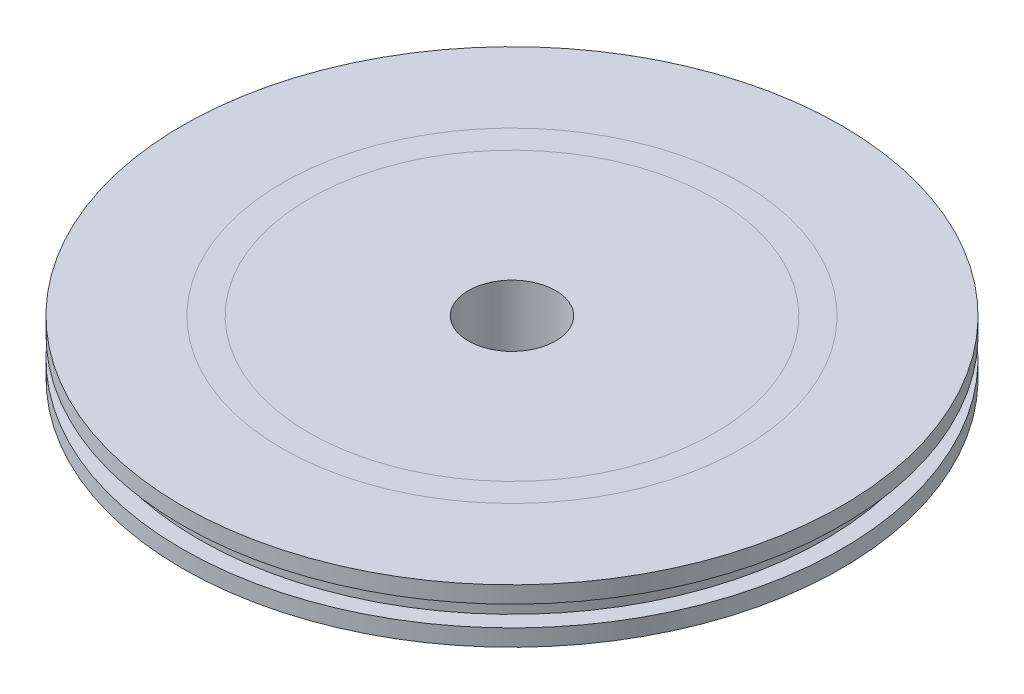
ISO-10303-21;
HEADER;
FILE_DESCRIPTION(('STEP AP214'),'2;1');
FILE_NAME('part.step','',(''),(''),'','','');
FILE_SCHEMA(('AUTOMOTIVE_DESIGN { 1 0 10303 214 1 1 1 1 }'));
ENDSEC;
DATA;
#1=APPLICATION_CONTEXT('core data for automotive mechanical design processes');
#2=APPLICATION_PROTOCOL_DEFINITION('international standard','automotive_design',2000,#1);
#3=PRODUCT_CONTEXT('',#1,'mechanical');
#4=PRODUCT('Part','Part','',(#3));
#5=PRODUCT_RELATED_PRODUCT_CATEGORY('part','',(#4));
#6=PRODUCT_DEFINITION_FORMATION('','',#4);
#7=PRODUCT_DEFINITION_CONTEXT('part definition',#1,'design');
#8=PRODUCT_DEFINITION('design','',#6,#7);
#9=PRODUCT_DEFINITION_SHAPE('','',#8);
#10=(LENGTH_UNIT() NAMED_UNIT(*) SI_UNIT(.MILLI.,.METRE.));
#11=(NAMED_UNIT(*) PLANE_ANGLE_UNIT() SI_UNIT($,.RADIAN.));
#12=(NAMED_UNIT(*) SI_UNIT($,.STERADIAN.) SOLID_ANGLE_UNIT());
#13=UNCERTAINTY_MEASURE_WITH_UNIT(LENGTH_MEASURE(1.E-05),#10,'distance_accuracy_value','');
#14=(GEOMETRIC_REPRESENTATION_CONTEXT(3) GLOBAL_UNCERTAINTY_ASSIGNED_CONTEXT((#13)) GLOBAL_UNIT_ASSIGNED_CONTEXT((#10,
#11,#12)) REPRESENTATION_CONTEXT('',''));
#15=CARTESIAN_POINT('',(0.,0.,0.));
#16=DIRECTION('',(0.,0.,1.));
#17=DIRECTION('',(1.,0.,0.));
#18=AXIS2_PLACEMENT_3D('',#15,#16,#17);
#19=CARTESIAN_POINT('',(0.,0.,30.9499));
#20=DIRECTION('',(0.,1.,0.));
#21=DIRECTION('',(0.,0.,1.));
#22=AXIS2_PLACEMENT_3D('',#19,#20,#21);
#23=PLANE('',#22);
#24=CARTESIAN_POINT('',(0.,0.,0.));
#25=DIRECTION('',(0.,1.,0.));
#26=DIRECTION('',(0.,0.,1.));
#27=AXIS2_PLACEMENT_3D('',#24,#25,#26);
#28=CIRCLE('',#27,30.9499);
#29=CARTESIAN_POINT('',(0.,0.,30.9499));
#30=VERTEX_POINT('',#29);
#31=EDGE_CURVE('E70',#30,#30,#28,.T.);
#32=ORIENTED_EDGE('',*,*,#31,.T.);
#33=EDGE_LOOP('',(#32));
#34=FACE_BOUND('',#33,.T.);
#35=CARTESIAN_POINT('',(0.,0.,0.));
#36=DIRECTION('',(0.,1.,0.));
#37=DIRECTION('',(0.,0.,1.));
#38=AXIS2_PLACEMENT_3D('',#35,#36,#37);
#39=CIRCLE('',#38,21.59);
#40=CARTESIAN_POINT('',(0.,0.,21.59));
#41=VERTEX_POINT('',#40);
#42=EDGE_CURVE('E51',#41,#41,#39,.F.);
#43=ORIENTED_EDGE('',*,*,#42,.T.);
#44=EDGE_LOOP('',(#43));
#45=FACE_BOUND('',#44,.T.);
#46=ADVANCED_FACE('F47',(#34,#45),#23,.T.);
#47=ORIENTED_EDGE('',*,*,#42,.F.);
#48=EDGE_LOOP('',(#47));
#49=FACE_BOUND('',#48,.T.);
#50=CARTESIAN_POINT('',(0.,0.,0.));
#51=DIRECTION('',(0.,1.,0.));
#52=DIRECTION('',(0.,0.,1.));
#53=AXIS2_PLACEMENT_3D('',#50,#51,#52);
#54=CIRCLE('',#53,19.05);
#55=CARTESIAN_POINT('',(0.,0.,19.05));
#56=VERTEX_POINT('',#55);
#57=EDGE_CURVE('E61',#56,#56,#54,.F.);
#58=ORIENTED_EDGE('',*,*,#57,.T.);
#59=EDGE_LOOP('',(#58));
#60=FACE_BOUND('',#59,.T.);
#61=ADVANCED_FACE('F98',(#49,#60),#23,.T.);
#62=CARTESIAN_POINT('',(0.,0.,0.));
#63=DIRECTION('',(0.,-1.,0.));
#64=DIRECTION('',(0.,0.,-1.));
#65=AXIS2_PLACEMENT_3D('',#62,#63,#64);
#66=CIRCLE('',#65,4.1021);
#67=CARTESIAN_POINT('',(0.,0.,-4.1021));
#68=VERTEX_POINT('',#67);
#69=EDGE_CURVE('E66',#68,#68,#66,.T.);
#70=ORIENTED_EDGE('',*,*,#69,.T.);
#71=EDGE_LOOP('',(#70));
#72=FACE_BOUND('',#71,.T.);
#73=ORIENTED_EDGE('',*,*,#57,.F.);
#74=EDGE_LOOP('',(#73));
#75=FACE_BOUND('',#74,.T.);
#76=ADVANCED_FACE('F49',(#72,#75),#23,.T.);
#77=CARTESIAN_POINT('',(0.,-5.08,0.));
#78=DIRECTION('',(0.,-1.,0.));
#79=DIRECTION('',(0.,0.,-1.));
#80=AXIS2_PLACEMENT_3D('',#77,#78,#79);
#81=PLANE('',#80);
#82=CARTESIAN_POINT('',(0.,-5.08,0.));
#83=DIRECTION('',(0.,-1.,0.));
#84=DIRECTION('',(0.,0.,-1.));
#85=AXIS2_PLACEMENT_3D('',#82,#83,#84);
#86=CIRCLE('',#85,22.86);
#87=CARTESIAN_POINT('',(0.,-5.08,-22.86));
#88=VERTEX_POINT('',#87);
#89=EDGE_CURVE('E10',#88,#88,#86,.T.);
#90=ORIENTED_EDGE('',*,*,#89,.F.);
#91=EDGE_LOOP('',(#90));
#92=FACE_BOUND('',#91,.T.);
#93=CARTESIAN_POINT('',(0.,-5.08,0.));
#94=DIRECTION('',(0.,1.,0.));
#95=DIRECTION('',(0.,0.,1.));
#96=AXIS2_PLACEMENT_3D('',#93,#94,#95);
#97=CIRCLE('',#96,30.9499);
#98=CARTESIAN_POINT('',(0.,-5.08,30.9499));
#99=VERTEX_POINT('',#98);
#100=EDGE_CURVE('E90',#99,#99,#97,.T.);
#101=ORIENTED_EDGE('',*,*,#100,.F.);
#102=EDGE_LOOP('',(#101));
#103=FACE_BOUND('',#102,.T.);
#104=ADVANCED_FACE('F101',(#92,#103),#81,.T.);
#105=CARTESIAN_POINT('',(0.,0.,0.));
#106=DIRECTION('',(0.,1.,0.));
#107=DIRECTION('',(0.,0.,1.));
#108=AXIS2_PLACEMENT_3D('',#105,#106,#107);
#109=CYLINDRICAL_SURFACE('',#108,30.9499);
#110=ORIENTED_EDGE('',*,*,#100,.T.);
#111=EDGE_LOOP('',(#110));
#112=FACE_BOUND('',#111,.T.);
#113=CARTESIAN_POINT('',(0.,-3.5052,0.));
#114=DIRECTION('',(0.,1.,0.));
#115=DIRECTION('',(0.,0.,1.));
#116=AXIS2_PLACEMENT_3D('',#113,#114,#115);
#117=CIRCLE('',#116,30.9499);
#118=CARTESIAN_POINT('',(0.,-3.5052,30.9499));
#119=VERTEX_POINT('',#118);
#120=EDGE_CURVE('E86',#119,#119,#117,.T.);
#121=ORIENTED_EDGE('',*,*,#120,.F.);
#122=EDGE_LOOP('',(#121));
#123=FACE_BOUND('',#122,.T.);
#124=ADVANCED_FACE('F107',(#112,#123),#109,.T.);
#125=CARTESIAN_POINT('',(0.,-3.5052,30.9499));
#126=DIRECTION('',(0.,1.,0.));
#127=DIRECTION('',(0.,0.,1.));
#128=AXIS2_PLACEMENT_3D('',#125,#126,#127);
#129=PLANE('',#128);
#130=ORIENTED_EDGE('',*,*,#120,.T.);
#131=EDGE_LOOP('',(#130));
#132=FACE_BOUND('',#131,.T.);
#133=CARTESIAN_POINT('',(0.,-3.5052,0.));
#134=DIRECTION('',(0.,1.,0.));
#135=DIRECTION('',(0.,0.,1.));
#136=AXIS2_PLACEMENT_3D('',#133,#134,#135);
#137=CIRCLE('',#136,29.3878);
#138=CARTESIAN_POINT('',(0.,-3.5052,29.3878));
#139=VERTEX_POINT('',#138);
#140=EDGE_CURVE('E82',#139,#139,#137,.T.);
#141=ORIENTED_EDGE('',*,*,#140,.F.);
#142=EDGE_LOOP('',(#141));
#143=FACE_BOUND('',#142,.T.);
#144=ADVANCED_FACE('F138',(#132,#143),#129,.T.);
#145=CARTESIAN_POINT('',(0.,0.,0.));
#146=DIRECTION('',(0.,1.,0.));
#147=DIRECTION('',(0.,0.,1.));
#148=AXIS2_PLACEMENT_3D('',#145,#146,#147);
#149=CYLINDRICAL_SURFACE('',#148,29.3878);
#150=ORIENTED_EDGE('',*,*,#140,.T.);
#151=EDGE_LOOP('',(#150));
#152=FACE_BOUND('',#151,.T.);
#153=CARTESIAN_POINT('',(0.,-1.5748,0.));
#154=DIRECTION('',(0.,1.,0.));
#155=DIRECTION('',(0.,0.,1.));
#156=AXIS2_PLACEMENT_3D('',#153,#154,#155);
#157=CIRCLE('',#156,29.3878);
#158=CARTESIAN_POINT('',(0.,-1.5748,29.3878));
#159=VERTEX_POINT('',#158);
#160=EDGE_CURVE('E78',#159,#159,#157,.T.);
#161=ORIENTED_EDGE('',*,*,#160,.F.);
#162=EDGE_LOOP('',(#161));
#163=FACE_BOUND('',#162,.T.);
#164=ADVANCED_FACE('F131',(#152,#163),#149,.T.);
#165=CARTESIAN_POINT('',(0.,-1.5748,29.3878));
#166=DIRECTION('',(0.,-1.,0.));
#167=DIRECTION('',(0.,0.,-1.));
#168=AXIS2_PLACEMENT_3D('',#165,#166,#167);
#169=PLANE('',#168);
#170=ORIENTED_EDGE('',*,*,#160,.T.);
#171=EDGE_LOOP('',(#170));
#172=FACE_BOUND('',#171,.T.);
#173=CARTESIAN_POINT('',(0.,-1.5748,0.));
#174=DIRECTION('',(0.,1.,0.));
#175=DIRECTION('',(0.,0.,1.));
#176=AXIS2_PLACEMENT_3D('',#173,#174,#175);
#177=CIRCLE('',#176,30.9499);
#178=CARTESIAN_POINT('',(0.,-1.5748,30.9499));
#179=VERTEX_POINT('',#178);
#180=EDGE_CURVE('E74',#179,#179,#177,.T.);
#181=ORIENTED_EDGE('',*,*,#180,.F.);
#182=EDGE_LOOP('',(#181));
#183=FACE_BOUND('',#182,.T.);
#184=ADVANCED_FACE('F121',(#172,#183),#169,.T.);
#185=CARTESIAN_POINT('',(0.,0.,0.));
#186=DIRECTION('',(0.,1.,0.));
#187=DIRECTION('',(0.,0.,1.));
#188=AXIS2_PLACEMENT_3D('',#185,#186,#187);
#189=CYLINDRICAL_SURFACE('',#188,30.9499);
#190=ORIENTED_EDGE('',*,*,#180,.T.);
#191=EDGE_LOOP('',(#190));
#192=FACE_BOUND('',#191,.T.);
#193=ORIENTED_EDGE('',*,*,#31,.F.);
#194=EDGE_LOOP('',(#193));
#195=FACE_BOUND('',#194,.T.);
#196=ADVANCED_FACE('F119',(#192,#195),#189,.T.);
#197=CARTESIAN_POINT('',(0.,0.,0.));
#198=DIRECTION('',(0.,-1.,0.));
#199=DIRECTION('',(0.,0.,-1.));
#200=AXIS2_PLACEMENT_3D('',#197,#198,#199);
#201=CYLINDRICAL_SURFACE('',#200,4.1021);
#202=ORIENTED_EDGE('',*,*,#69,.F.);
#203=EDGE_LOOP('',(#202));
#204=FACE_BOUND('',#203,.T.);
#205=CARTESIAN_POINT('',(0.,-6.096,0.));
#206=DIRECTION('',(0.,-1.,0.));
#207=DIRECTION('',(0.,0.,-1.));
#208=AXIS2_PLACEMENT_3D('',#205,#206,#207);
#209=CIRCLE('',#208,4.1021);
#210=CARTESIAN_POINT('',(0.,-6.096,-4.1021));
#211=VERTEX_POINT('',#210);
#212=EDGE_CURVE('E232',#211,#211,#209,.T.);
#213=ORIENTED_EDGE('',*,*,#212,.T.);
#214=EDGE_LOOP('',(#213));
#215=FACE_BOUND('',#214,.T.);
#216=ADVANCED_FACE('F120',(#204,#215),#201,.F.);
#217=CARTESIAN_POINT('',(0.,-6.096,0.));
#218=DIRECTION('',(0.,-1.,0.));
#219=DIRECTION('',(0.,0.,-1.));
#220=AXIS2_PLACEMENT_3D('',#217,#218,#219);
#221=PLANE('',#220);
#222=CARTESIAN_POINT('',(0.,-6.096,0.));
#223=DIRECTION('',(0.,-1.,0.));
#224=DIRECTION('',(0.,0.,-1.));
#225=AXIS2_PLACEMENT_3D('',#222,#223,#224);
#226=CIRCLE('',#225,22.86);
#227=CARTESIAN_POINT('',(0.,-6.096,-22.86));
#228=VERTEX_POINT('',#227);
#229=EDGE_CURVE('E64',#228,#228,#226,.T.);
#230=ORIENTED_EDGE('',*,*,#229,.T.);
#231=EDGE_LOOP('',(#230));
#232=FACE_BOUND('',#231,.T.);
#233=ORIENTED_EDGE('',*,*,#212,.F.);
#234=EDGE_LOOP('',(#233));
#235=FACE_BOUND('',#234,.T.);
#236=ADVANCED_FACE('F128',(#232,#235),#221,.T.);
#237=CARTESIAN_POINT('',(0.,-6.096,0.));
#238=DIRECTION('',(0.,1.,0.));
#239=DIRECTION('',(0.,0.,1.));
#240=AXIS2_PLACEMENT_3D('',#237,#238,#239);
#241=CYLINDRICAL_SURFACE('',#240,22.86);
#242=ORIENTED_EDGE('',*,*,#229,.F.);
#243=EDGE_LOOP('',(#242));
#244=FACE_BOUND('',#243,.T.);
#245=ORIENTED_EDGE('',*,*,#89,.T.);
#246=EDGE_LOOP('',(#245));
#247=FACE_BOUND('',#246,.T.);
#248=ADVANCED_FACE('F217',(#244,#247),#241,.T.);
#249=CLOSED_SHELL('',(#46,#61,#76,#104,#124,#144,#164,#184,#196,#216,#236,#248));
#250=MANIFOLD_SOLID_BREP('B2',#249);
#251=ADVANCED_BREP_SHAPE_REPRESENTATION('',(#18,#250),#14);
#252=SHAPE_DEFINITION_REPRESENTATION(#9,#251);
ENDSEC;
END-ISO-10303-21;
